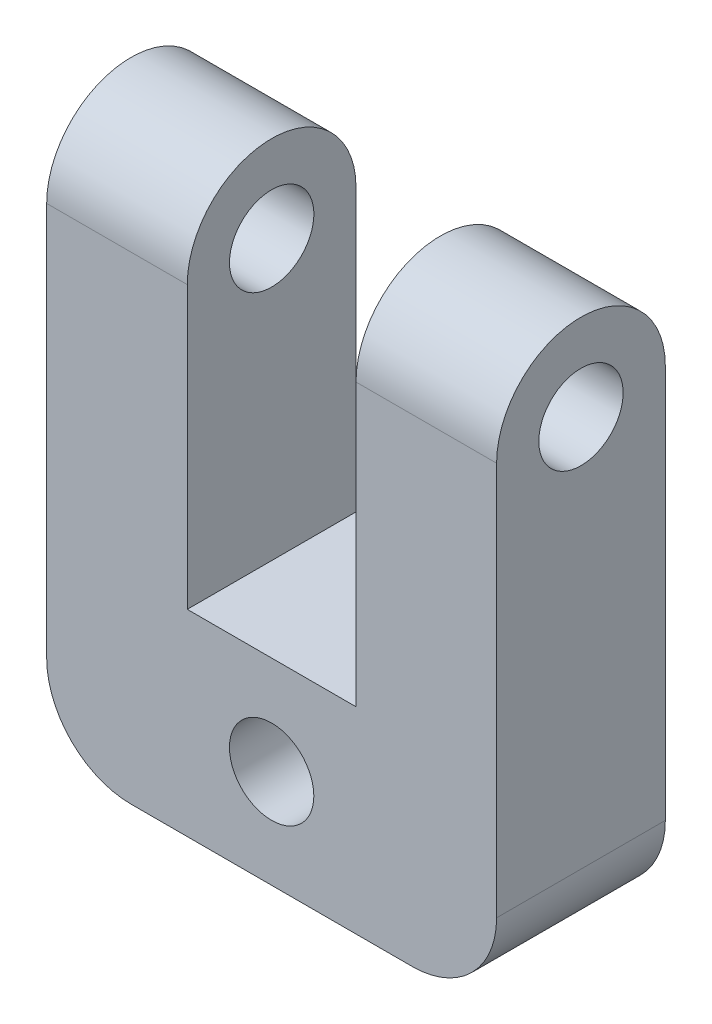
ISO-10303-21;
HEADER;
FILE_DESCRIPTION(('STEP AP214'),'2;1');
FILE_NAME('part.step','',(''),(''),'','','');
FILE_SCHEMA(('AUTOMOTIVE_DESIGN { 1 0 10303 214 1 1 1 1 }'));
ENDSEC;
DATA;
#1=APPLICATION_CONTEXT('core data for automotive mechanical design processes');
#2=APPLICATION_PROTOCOL_DEFINITION('international standard','automotive_design',2000,#1);
#3=PRODUCT_CONTEXT('',#1,'mechanical');
#4=PRODUCT('Part','Part','',(#3));
#5=PRODUCT_RELATED_PRODUCT_CATEGORY('part','',(#4));
#6=PRODUCT_DEFINITION_FORMATION('','',#4);
#7=PRODUCT_DEFINITION_CONTEXT('part definition',#1,'design');
#8=PRODUCT_DEFINITION('design','',#6,#7);
#9=PRODUCT_DEFINITION_SHAPE('','',#8);
#10=(LENGTH_UNIT() NAMED_UNIT(*) SI_UNIT(.MILLI.,.METRE.));
#11=(NAMED_UNIT(*) PLANE_ANGLE_UNIT() SI_UNIT($,.RADIAN.));
#12=(NAMED_UNIT(*) SI_UNIT($,.STERADIAN.) SOLID_ANGLE_UNIT());
#13=UNCERTAINTY_MEASURE_WITH_UNIT(LENGTH_MEASURE(1.E-05),#10,'distance_accuracy_value','');
#14=(GEOMETRIC_REPRESENTATION_CONTEXT(3) GLOBAL_UNCERTAINTY_ASSIGNED_CONTEXT((#13)) GLOBAL_UNIT_ASSIGNED_CONTEXT((#10,
#11,#12)) REPRESENTATION_CONTEXT('',''));
#15=CARTESIAN_POINT('',(0.,0.,0.));
#16=DIRECTION('',(0.,0.,1.));
#17=DIRECTION('',(1.,0.,0.));
#18=AXIS2_PLACEMENT_3D('',#15,#16,#17);
#19=CARTESIAN_POINT('',(-4.99999999999999,3.,2.99999999999999));
#20=DIRECTION('',(0.,0.,1.));
#21=DIRECTION('',(1.,0.,0.));
#22=AXIS2_PLACEMENT_3D('',#19,#20,#21);
#23=CYLINDRICAL_SURFACE('',#22,3.);
#24=DIRECTION('',(0.,0.,1.));
#25=VECTOR('',#24,1.);
#26=CARTESIAN_POINT('',(-7.99999999999999,3.,3.));
#27=LINE('',#26,#25);
#28=CARTESIAN_POINT('',(-8.00000000000001,3.,-3.));
#29=VERTEX_POINT('',#28);
#30=CARTESIAN_POINT('',(-7.99999999999999,3.,3.));
#31=VERTEX_POINT('',#30);
#32=EDGE_CURVE('E175',#29,#31,#27,.T.);
#33=ORIENTED_EDGE('',*,*,#32,.F.);
#34=CARTESIAN_POINT('',(-5.00000000000001,3.,-3.));
#35=DIRECTION('',(0.,0.,1.));
#36=DIRECTION('',(1.,0.,0.));
#37=AXIS2_PLACEMENT_3D('',#34,#35,#36);
#38=CIRCLE('',#37,3.);
#39=CARTESIAN_POINT('',(-5.00000000000001,0.,-3.));
#40=VERTEX_POINT('',#39);
#41=EDGE_CURVE('E45',#40,#29,#38,.F.);
#42=ORIENTED_EDGE('',*,*,#41,.F.);
#43=DIRECTION('',(0.,0.,1.));
#44=VECTOR('',#43,1.);
#45=CARTESIAN_POINT('',(-5.,0.,0.));
#46=LINE('',#45,#44);
#47=CARTESIAN_POINT('',(-4.99999999999999,0.,3.));
#48=VERTEX_POINT('',#47);
#49=EDGE_CURVE('E178',#48,#40,#46,.F.);
#50=ORIENTED_EDGE('',*,*,#49,.F.);
#51=CARTESIAN_POINT('',(-4.99999999999999,3.,3.));
#52=DIRECTION('',(0.,0.,-1.));
#53=DIRECTION('',(-1.,0.,0.));
#54=AXIS2_PLACEMENT_3D('',#51,#52,#53);
#55=CIRCLE('',#54,3.);
#56=EDGE_CURVE('E11',#31,#48,#55,.F.);
#57=ORIENTED_EDGE('',*,*,#56,.F.);
#58=EDGE_LOOP('',(#33,#42,#50,#57));
#59=FACE_BOUND('',#58,.T.);
#60=ADVANCED_FACE('F38',(#59),#23,.T.);
#61=CARTESIAN_POINT('',(4.99999999999999,3.,-2.99999999999999));
#62=DIRECTION('',(0.,0.,-1.));
#63=DIRECTION('',(-1.,0.,0.));
#64=AXIS2_PLACEMENT_3D('',#61,#62,#63);
#65=CYLINDRICAL_SURFACE('',#64,3.);
#66=DIRECTION('',(0.,0.,-1.));
#67=VECTOR('',#66,1.);
#68=CARTESIAN_POINT('',(7.99999999999999,3.,-3.));
#69=LINE('',#68,#67);
#70=CARTESIAN_POINT('',(8.00000000000001,3.,3.));
#71=VERTEX_POINT('',#70);
#72=CARTESIAN_POINT('',(7.99999999999999,3.,-3.));
#73=VERTEX_POINT('',#72);
#74=EDGE_CURVE('E161',#71,#73,#69,.T.);
#75=ORIENTED_EDGE('',*,*,#74,.F.);
#76=CARTESIAN_POINT('',(5.00000000000001,3.,3.));
#77=DIRECTION('',(0.,0.,-1.));
#78=DIRECTION('',(-1.,0.,0.));
#79=AXIS2_PLACEMENT_3D('',#76,#77,#78);
#80=CIRCLE('',#79,3.);
#81=CARTESIAN_POINT('',(5.00000000000001,0.,3.));
#82=VERTEX_POINT('',#81);
#83=EDGE_CURVE('E171',#82,#71,#80,.F.);
#84=ORIENTED_EDGE('',*,*,#83,.F.);
#85=DIRECTION('',(0.,0.,-1.));
#86=VECTOR('',#85,1.);
#87=CARTESIAN_POINT('',(5.,0.,0.));
#88=LINE('',#87,#86);
#89=CARTESIAN_POINT('',(4.99999999999999,0.,-3.));
#90=VERTEX_POINT('',#89);
#91=EDGE_CURVE('E168',#90,#82,#88,.F.);
#92=ORIENTED_EDGE('',*,*,#91,.F.);
#93=CARTESIAN_POINT('',(4.99999999999999,3.,-3.));
#94=DIRECTION('',(0.,0.,1.));
#95=DIRECTION('',(1.,0.,0.));
#96=AXIS2_PLACEMENT_3D('',#93,#94,#95);
#97=CIRCLE('',#96,3.);
#98=EDGE_CURVE('E173',#73,#90,#97,.F.);
#99=ORIENTED_EDGE('',*,*,#98,.F.);
#100=EDGE_LOOP('',(#75,#84,#92,#99));
#101=FACE_BOUND('',#100,.T.);
#102=ADVANCED_FACE('F236',(#101),#65,.T.);
#103=CARTESIAN_POINT('',(-8.,17.,0.));
#104=DIRECTION('',(1.,0.,0.));
#105=DIRECTION('',(0.,0.,-1.));
#106=AXIS2_PLACEMENT_3D('',#103,#104,#105);
#107=CYLINDRICAL_SURFACE('',#106,3.);
#108=CARTESIAN_POINT('',(-3.,17.,0.));
#109=DIRECTION('',(-1.,0.,0.));
#110=DIRECTION('',(0.,0.,-1.));
#111=AXIS2_PLACEMENT_3D('',#108,#109,#110);
#112=CIRCLE('',#111,3.);
#113=CARTESIAN_POINT('',(-3.,17.,2.99999999999997));
#114=VERTEX_POINT('',#113);
#115=CARTESIAN_POINT('',(-3.,17.,-3.00000000000003));
#116=VERTEX_POINT('',#115);
#117=EDGE_CURVE('E192',#114,#116,#112,.T.);
#118=ORIENTED_EDGE('',*,*,#117,.T.);
#119=DIRECTION('',(1.,0.,0.));
#120=VECTOR('',#119,1.);
#121=CARTESIAN_POINT('',(-8.,17.,-3.00000000000003));
#122=LINE('',#121,#120);
#123=CARTESIAN_POINT('',(-8.,17.,-3.00000000000003));
#124=VERTEX_POINT('',#123);
#125=EDGE_CURVE('E138',#124,#116,#122,.T.);
#126=ORIENTED_EDGE('',*,*,#125,.F.);
#127=CARTESIAN_POINT('',(-8.,17.,0.));
#128=DIRECTION('',(-1.,0.,0.));
#129=DIRECTION('',(0.,0.,-1.));
#130=AXIS2_PLACEMENT_3D('',#127,#128,#129);
#131=CIRCLE('',#130,3.);
#132=CARTESIAN_POINT('',(-8.,17.,2.99999999999997));
#133=VERTEX_POINT('',#132);
#134=EDGE_CURVE('E185',#133,#124,#131,.T.);
#135=ORIENTED_EDGE('',*,*,#134,.F.);
#136=DIRECTION('',(1.,0.,0.));
#137=VECTOR('',#136,1.);
#138=CARTESIAN_POINT('',(-8.,17.,2.99999999999997));
#139=LINE('',#138,#137);
#140=EDGE_CURVE('E139',#133,#114,#139,.T.);
#141=ORIENTED_EDGE('',*,*,#140,.T.);
#142=EDGE_LOOP('',(#118,#126,#135,#141));
#143=FACE_BOUND('',#142,.T.);
#144=ADVANCED_FACE('F191',(#143),#107,.T.);
#145=CARTESIAN_POINT('',(-8.,16.9237361607283,-0.000581651149853182));
#146=DIRECTION('',(1.,0.,0.));
#147=DIRECTION('',(0.,0.,-1.));
#148=AXIS2_PLACEMENT_3D('',#145,#146,#147);
#149=CYLINDRICAL_SURFACE('',#148,1.5);
#150=CARTESIAN_POINT('',(-8.,16.9237361607283,-0.000581651149853182));
#151=DIRECTION('',(-1.,0.,0.));
#152=DIRECTION('',(0.,0.,1.));
#153=AXIS2_PLACEMENT_3D('',#150,#151,#152);
#154=CIRCLE('',#153,1.5);
#155=CARTESIAN_POINT('',(-8.,16.9237361607283,1.49941834885015));
#156=VERTEX_POINT('',#155);
#157=EDGE_CURVE('E210',#156,#156,#154,.T.);
#158=ORIENTED_EDGE('',*,*,#157,.T.);
#159=EDGE_LOOP('',(#158));
#160=FACE_BOUND('',#159,.T.);
#161=CARTESIAN_POINT('',(-3.,16.9237361607283,-0.000581651149852893));
#162=DIRECTION('',(-1.,0.,0.));
#163=DIRECTION('',(0.,0.,1.));
#164=AXIS2_PLACEMENT_3D('',#161,#162,#163);
#165=CIRCLE('',#164,1.5);
#166=CARTESIAN_POINT('',(-3.,16.9237361607283,1.49941834885015));
#167=VERTEX_POINT('',#166);
#168=EDGE_CURVE('E268',#167,#167,#165,.T.);
#169=ORIENTED_EDGE('',*,*,#168,.F.);
#170=EDGE_LOOP('',(#169));
#171=FACE_BOUND('',#170,.T.);
#172=ADVANCED_FACE('F223',(#160,#171),#149,.F.);
#173=CARTESIAN_POINT('',(7.99999999999999,7.,-3.));
#174=DIRECTION('',(-1.,0.,0.));
#175=DIRECTION('',(0.,0.,1.));
#176=AXIS2_PLACEMENT_3D('',#173,#174,#175);
#177=PLANE('',#176);
#178=DIRECTION('',(0.,-1.,0.));
#179=VECTOR('',#178,1.);
#180=CARTESIAN_POINT('',(8.00000000000001,7.,3.));
#181=LINE('',#180,#179);
#182=CARTESIAN_POINT('',(8.,17.,2.99999999999997));
#183=VERTEX_POINT('',#182);
#184=EDGE_CURVE('E151',#183,#71,#181,.T.);
#185=ORIENTED_EDGE('',*,*,#184,.T.);
#186=ORIENTED_EDGE('',*,*,#74,.T.);
#187=DIRECTION('',(0.,-1.,0.));
#188=VECTOR('',#187,1.);
#189=CARTESIAN_POINT('',(7.99999999999999,7.,-3.));
#190=LINE('',#189,#188);
#191=CARTESIAN_POINT('',(8.,17.,-3.00000000000003));
#192=VERTEX_POINT('',#191);
#193=EDGE_CURVE('E159',#192,#73,#190,.T.);
#194=ORIENTED_EDGE('',*,*,#193,.F.);
#195=CARTESIAN_POINT('',(8.,17.,0.));
#196=DIRECTION('',(-1.,0.,0.));
#197=DIRECTION('',(0.,0.,-1.));
#198=AXIS2_PLACEMENT_3D('',#195,#196,#197);
#199=CIRCLE('',#198,3.);
#200=EDGE_CURVE('E137',#183,#192,#199,.T.);
#201=ORIENTED_EDGE('',*,*,#200,.F.);
#202=EDGE_LOOP('',(#185,#186,#194,#201));
#203=FACE_BOUND('',#202,.T.);
#204=CARTESIAN_POINT('',(8.,16.9237361607283,-0.000581651149852257));
#205=DIRECTION('',(-1.,0.,0.));
#206=DIRECTION('',(0.,0.,1.));
#207=AXIS2_PLACEMENT_3D('',#204,#205,#206);
#208=CIRCLE('',#207,1.5);
#209=CARTESIAN_POINT('',(8.,16.9237361607283,1.49941834885015));
#210=VERTEX_POINT('',#209);
#211=EDGE_CURVE('E208',#210,#210,#208,.T.);
#212=ORIENTED_EDGE('',*,*,#211,.T.);
#213=EDGE_LOOP('',(#212));
#214=FACE_BOUND('',#213,.T.);
#215=ADVANCED_FACE('F216',(#203,#214),#177,.F.);
#216=CARTESIAN_POINT('',(-8.00000000000001,7.,-3.));
#217=DIRECTION('',(0.,0.,1.));
#218=DIRECTION('',(1.,0.,0.));
#219=AXIS2_PLACEMENT_3D('',#216,#217,#218);
#220=PLANE('',#219);
#221=CARTESIAN_POINT('',(0.,3.5,-3.));
#222=DIRECTION('',(0.,0.,1.));
#223=DIRECTION('',(1.,0.,0.));
#224=AXIS2_PLACEMENT_3D('',#221,#222,#223);
#225=CIRCLE('',#224,1.5);
#226=CARTESIAN_POINT('',(1.49999999999999,3.5,-3.));
#227=VERTEX_POINT('',#226);
#228=EDGE_CURVE('E165',#227,#227,#225,.T.);
#229=ORIENTED_EDGE('',*,*,#228,.T.);
#230=EDGE_LOOP('',(#229));
#231=FACE_BOUND('',#230,.T.);
#232=DIRECTION('',(-1.,0.,0.));
#233=VECTOR('',#232,1.);
#234=CARTESIAN_POINT('',(-8.00000000000001,0.,-3.));
#235=LINE('',#234,#233);
#236=EDGE_CURVE('E142',#90,#40,#235,.T.);
#237=ORIENTED_EDGE('',*,*,#236,.T.);
#238=ORIENTED_EDGE('',*,*,#41,.T.);
#239=DIRECTION('',(0.,-1.,0.));
#240=VECTOR('',#239,1.);
#241=CARTESIAN_POINT('',(-8.00000000000001,7.,-3.));
#242=LINE('',#241,#240);
#243=EDGE_CURVE('E156',#124,#29,#242,.T.);
#244=ORIENTED_EDGE('',*,*,#243,.F.);
#245=ORIENTED_EDGE('',*,*,#125,.T.);
#246=DIRECTION('',(0.,-1.,0.));
#247=VECTOR('',#246,1.);
#248=CARTESIAN_POINT('',(-3.,7.,-3.));
#249=LINE('',#248,#247);
#250=CARTESIAN_POINT('',(-3.,7.,-3.));
#251=VERTEX_POINT('',#250);
#252=EDGE_CURVE('E193',#116,#251,#249,.T.);
#253=ORIENTED_EDGE('',*,*,#252,.T.);
#254=DIRECTION('',(-1.,0.,0.));
#255=VECTOR('',#254,1.);
#256=CARTESIAN_POINT('',(3.,7.,-3.));
#257=LINE('',#256,#255);
#258=CARTESIAN_POINT('',(3.,7.,-3.));
#259=VERTEX_POINT('',#258);
#260=EDGE_CURVE('E131',#259,#251,#257,.T.);
#261=ORIENTED_EDGE('',*,*,#260,.F.);
#262=DIRECTION('',(0.,-1.,0.));
#263=VECTOR('',#262,1.);
#264=CARTESIAN_POINT('',(3.,7.,-3.));
#265=LINE('',#264,#263);
#266=CARTESIAN_POINT('',(3.,17.,-3.00000000000003));
#267=VERTEX_POINT('',#266);
#268=EDGE_CURVE('E115',#267,#259,#265,.T.);
#269=ORIENTED_EDGE('',*,*,#268,.F.);
#270=EDGE_CURVE('E128',#267,#192,#122,.T.);
#271=ORIENTED_EDGE('',*,*,#270,.T.);
#272=ORIENTED_EDGE('',*,*,#193,.T.);
#273=ORIENTED_EDGE('',*,*,#98,.T.);
#274=EDGE_LOOP('',(#237,#238,#244,#245,#253,#261,#269,#271,#272,#273));
#275=FACE_BOUND('',#274,.T.);
#276=ADVANCED_FACE('F126',(#231,#275),#220,.F.);
#277=CARTESIAN_POINT('',(-7.99999999999999,7.,3.));
#278=DIRECTION('',(1.,0.,0.));
#279=DIRECTION('',(0.,0.,-1.));
#280=AXIS2_PLACEMENT_3D('',#277,#278,#279);
#281=PLANE('',#280);
#282=ORIENTED_EDGE('',*,*,#243,.T.);
#283=ORIENTED_EDGE('',*,*,#32,.T.);
#284=DIRECTION('',(0.,-1.,0.));
#285=VECTOR('',#284,1.);
#286=CARTESIAN_POINT('',(-7.99999999999999,7.,3.));
#287=LINE('',#286,#285);
#288=EDGE_CURVE('E154',#133,#31,#287,.T.);
#289=ORIENTED_EDGE('',*,*,#288,.F.);
#290=ORIENTED_EDGE('',*,*,#134,.T.);
#291=EDGE_LOOP('',(#282,#283,#289,#290));
#292=FACE_BOUND('',#291,.T.);
#293=ORIENTED_EDGE('',*,*,#157,.F.);
#294=EDGE_LOOP('',(#293));
#295=FACE_BOUND('',#294,.T.);
#296=ADVANCED_FACE('F182',(#292,#295),#281,.F.);
#297=CARTESIAN_POINT('',(-7.99999999999999,7.,3.));
#298=DIRECTION('',(0.,0.,-1.));
#299=DIRECTION('',(-1.,0.,0.));
#300=AXIS2_PLACEMENT_3D('',#297,#298,#299);
#301=PLANE('',#300);
#302=CARTESIAN_POINT('',(0.,3.5,3.));
#303=DIRECTION('',(0.,0.,-1.));
#304=DIRECTION('',(-1.,0.,0.));
#305=AXIS2_PLACEMENT_3D('',#302,#303,#304);
#306=CIRCLE('',#305,1.5);
#307=CARTESIAN_POINT('',(-1.50000000000001,3.5,3.));
#308=VERTEX_POINT('',#307);
#309=EDGE_CURVE('E162',#308,#308,#306,.T.);
#310=ORIENTED_EDGE('',*,*,#309,.T.);
#311=EDGE_LOOP('',(#310));
#312=FACE_BOUND('',#311,.T.);
#313=ORIENTED_EDGE('',*,*,#288,.T.);
#314=ORIENTED_EDGE('',*,*,#56,.T.);
#315=DIRECTION('',(1.,0.,0.));
#316=VECTOR('',#315,1.);
#317=CARTESIAN_POINT('',(-7.99999999999999,0.,3.));
#318=LINE('',#317,#316);
#319=EDGE_CURVE('E149',#48,#82,#318,.T.);
#320=ORIENTED_EDGE('',*,*,#319,.T.);
#321=ORIENTED_EDGE('',*,*,#83,.T.);
#322=ORIENTED_EDGE('',*,*,#184,.F.);
#323=CARTESIAN_POINT('',(3.,17.,2.99999999999997));
#324=VERTEX_POINT('',#323);
#325=EDGE_CURVE('E144',#324,#183,#139,.T.);
#326=ORIENTED_EDGE('',*,*,#325,.F.);
#327=DIRECTION('',(0.,1.,0.));
#328=VECTOR('',#327,1.);
#329=CARTESIAN_POINT('',(3.,7.,3.));
#330=LINE('',#329,#328);
#331=CARTESIAN_POINT('',(3.,7.,3.));
#332=VERTEX_POINT('',#331);
#333=EDGE_CURVE('E118',#332,#324,#330,.T.);
#334=ORIENTED_EDGE('',*,*,#333,.F.);
#335=DIRECTION('',(-1.,0.,0.));
#336=VECTOR('',#335,1.);
#337=CARTESIAN_POINT('',(3.,7.,3.));
#338=LINE('',#337,#336);
#339=CARTESIAN_POINT('',(-3.,7.,3.));
#340=VERTEX_POINT('',#339);
#341=EDGE_CURVE('E205',#332,#340,#338,.T.);
#342=ORIENTED_EDGE('',*,*,#341,.T.);
#343=DIRECTION('',(0.,1.,0.));
#344=VECTOR('',#343,1.);
#345=CARTESIAN_POINT('',(-3.,7.,3.));
#346=LINE('',#345,#344);
#347=EDGE_CURVE('E122',#340,#114,#346,.T.);
#348=ORIENTED_EDGE('',*,*,#347,.T.);
#349=ORIENTED_EDGE('',*,*,#140,.F.);
#350=EDGE_LOOP('',(#313,#314,#320,#321,#322,#326,#334,#342,#348,#349));
#351=FACE_BOUND('',#350,.T.);
#352=ADVANCED_FACE('F254',(#312,#351),#301,.F.);
#353=CARTESIAN_POINT('',(0.,0.,0.));
#354=DIRECTION('',(0.,1.,0.));
#355=DIRECTION('',(0.,0.,1.));
#356=AXIS2_PLACEMENT_3D('',#353,#354,#355);
#357=PLANE('',#356);
#358=ORIENTED_EDGE('',*,*,#319,.F.);
#359=ORIENTED_EDGE('',*,*,#49,.T.);
#360=ORIENTED_EDGE('',*,*,#236,.F.);
#361=ORIENTED_EDGE('',*,*,#91,.T.);
#362=EDGE_LOOP('',(#358,#359,#360,#361));
#363=FACE_BOUND('',#362,.T.);
#364=ADVANCED_FACE('F230',(#363),#357,.F.);
#365=ORIENTED_EDGE('',*,*,#270,.F.);
#366=CARTESIAN_POINT('',(3.,17.,0.));
#367=DIRECTION('',(-1.,0.,0.));
#368=DIRECTION('',(0.,0.,-1.));
#369=AXIS2_PLACEMENT_3D('',#366,#367,#368);
#370=CIRCLE('',#369,3.);
#371=EDGE_CURVE('E111',#324,#267,#370,.T.);
#372=ORIENTED_EDGE('',*,*,#371,.F.);
#373=ORIENTED_EDGE('',*,*,#325,.T.);
#374=ORIENTED_EDGE('',*,*,#200,.T.);
#375=EDGE_LOOP('',(#365,#372,#373,#374));
#376=FACE_BOUND('',#375,.T.);
#377=ADVANCED_FACE('F135',(#376),#107,.T.);
#378=CARTESIAN_POINT('',(3.,16.9237361607283,-0.000581651149852546));
#379=DIRECTION('',(-1.,0.,0.));
#380=DIRECTION('',(0.,0.,1.));
#381=AXIS2_PLACEMENT_3D('',#378,#379,#380);
#382=CIRCLE('',#381,1.5);
#383=CARTESIAN_POINT('',(3.,16.9237361607283,1.49941834885015));
#384=VERTEX_POINT('',#383);
#385=EDGE_CURVE('E199',#384,#384,#382,.T.);
#386=ORIENTED_EDGE('',*,*,#385,.T.);
#387=EDGE_LOOP('',(#386));
#388=FACE_BOUND('',#387,.T.);
#389=ORIENTED_EDGE('',*,*,#211,.F.);
#390=EDGE_LOOP('',(#389));
#391=FACE_BOUND('',#390,.T.);
#392=ADVANCED_FACE('F218',(#388,#391),#149,.F.);
#393=CARTESIAN_POINT('',(3.,7.,3.));
#394=DIRECTION('',(0.,-1.,0.));
#395=DIRECTION('',(0.,0.,-1.));
#396=AXIS2_PLACEMENT_3D('',#393,#394,#395);
#397=PLANE('',#396);
#398=DIRECTION('',(0.,0.,1.));
#399=VECTOR('',#398,1.);
#400=CARTESIAN_POINT('',(-3.,7.,3.));
#401=LINE('',#400,#399);
#402=EDGE_CURVE('E196',#251,#340,#401,.T.);
#403=ORIENTED_EDGE('',*,*,#402,.T.);
#404=ORIENTED_EDGE('',*,*,#341,.F.);
#405=DIRECTION('',(0.,0.,1.));
#406=VECTOR('',#405,1.);
#407=CARTESIAN_POINT('',(3.,7.,3.));
#408=LINE('',#407,#406);
#409=EDGE_CURVE('E132',#259,#332,#408,.T.);
#410=ORIENTED_EDGE('',*,*,#409,.F.);
#411=ORIENTED_EDGE('',*,*,#260,.T.);
#412=EDGE_LOOP('',(#403,#404,#410,#411));
#413=FACE_BOUND('',#412,.T.);
#414=ADVANCED_FACE('F220',(#413),#397,.F.);
#415=CARTESIAN_POINT('',(3.,17.,0.));
#416=DIRECTION('',(1.,0.,0.));
#417=DIRECTION('',(0.,0.,-1.));
#418=AXIS2_PLACEMENT_3D('',#415,#416,#417);
#419=PLANE('',#418);
#420=ORIENTED_EDGE('',*,*,#385,.F.);
#421=EDGE_LOOP('',(#420));
#422=FACE_BOUND('',#421,.T.);
#423=ORIENTED_EDGE('',*,*,#371,.T.);
#424=ORIENTED_EDGE('',*,*,#268,.T.);
#425=ORIENTED_EDGE('',*,*,#409,.T.);
#426=ORIENTED_EDGE('',*,*,#333,.T.);
#427=EDGE_LOOP('',(#423,#424,#425,#426));
#428=FACE_BOUND('',#427,.T.);
#429=ADVANCED_FACE('F113',(#422,#428),#419,.F.);
#430=CARTESIAN_POINT('',(-3.,17.,0.));
#431=DIRECTION('',(1.,0.,0.));
#432=DIRECTION('',(0.,0.,-1.));
#433=AXIS2_PLACEMENT_3D('',#430,#431,#432);
#434=PLANE('',#433);
#435=ORIENTED_EDGE('',*,*,#168,.T.);
#436=EDGE_LOOP('',(#435));
#437=FACE_BOUND('',#436,.T.);
#438=ORIENTED_EDGE('',*,*,#117,.F.);
#439=ORIENTED_EDGE('',*,*,#347,.F.);
#440=ORIENTED_EDGE('',*,*,#402,.F.);
#441=ORIENTED_EDGE('',*,*,#252,.F.);
#442=EDGE_LOOP('',(#438,#439,#440,#441));
#443=FACE_BOUND('',#442,.T.);
#444=ADVANCED_FACE('F277',(#437,#443),#434,.T.);
#445=CARTESIAN_POINT('',(0.,3.5,-4.99999999999997));
#446=DIRECTION('',(0.,0.,1.));
#447=DIRECTION('',(1.,0.,0.));
#448=AXIS2_PLACEMENT_3D('',#445,#446,#447);
#449=CYLINDRICAL_SURFACE('',#448,1.5);
#450=ORIENTED_EDGE('',*,*,#309,.F.);
#451=EDGE_LOOP('',(#450));
#452=FACE_BOUND('',#451,.T.);
#453=ORIENTED_EDGE('',*,*,#228,.F.);
#454=EDGE_LOOP('',(#453));
#455=FACE_BOUND('',#454,.T.);
#456=ADVANCED_FACE('F275',(#452,#455),#449,.F.);
#457=CLOSED_SHELL('',(#60,#102,#144,#172,#215,#276,#296,#352,#364,#377,#392,#414,#429,#444,#456));
#458=MANIFOLD_SOLID_BREP('B2',#457);
#459=ADVANCED_BREP_SHAPE_REPRESENTATION('',(#18,#458),#14);
#460=SHAPE_DEFINITION_REPRESENTATION(#9,#459);
ENDSEC;
END-ISO-10303-21;
